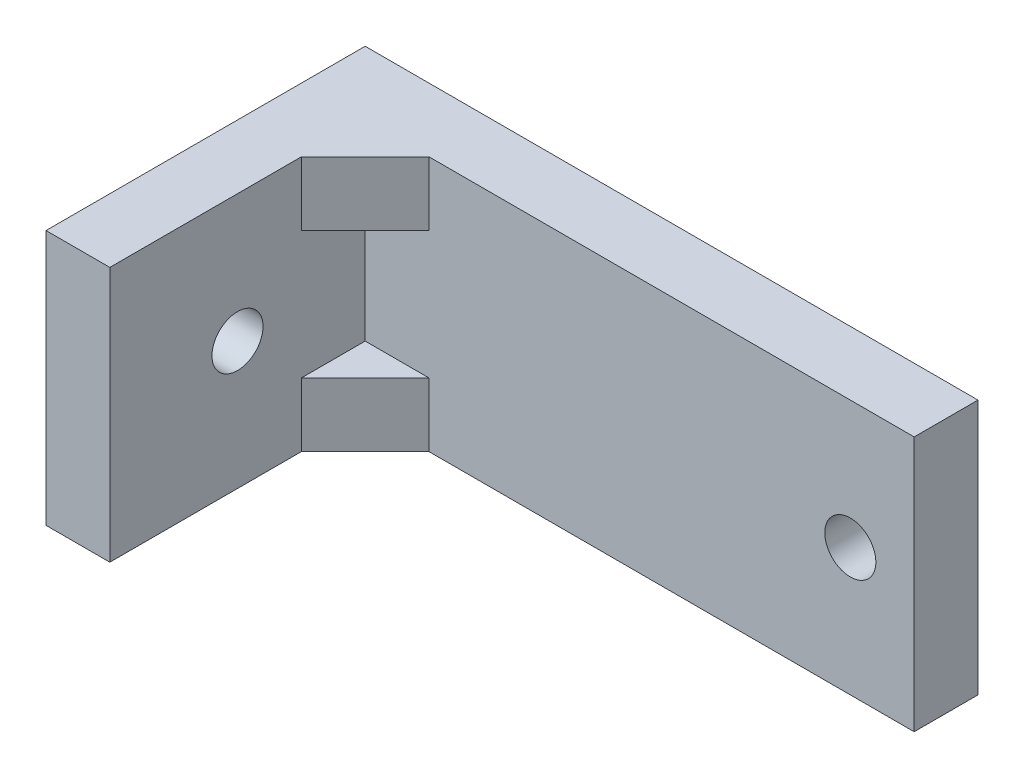
ISO-10303-21;
HEADER;
FILE_DESCRIPTION(('STEP AP214'),'2;1');
FILE_NAME('part.step','',(''),(''),'','','');
FILE_SCHEMA(('AUTOMOTIVE_DESIGN { 1 0 10303 214 1 1 1 1 }'));
ENDSEC;
DATA;
#1=APPLICATION_CONTEXT('core data for automotive mechanical design processes');
#2=APPLICATION_PROTOCOL_DEFINITION('international standard','automotive_design',2000,#1);
#3=PRODUCT_CONTEXT('',#1,'mechanical');
#4=PRODUCT('Part','Part','',(#3));
#5=PRODUCT_RELATED_PRODUCT_CATEGORY('part','',(#4));
#6=PRODUCT_DEFINITION_FORMATION('','',#4);
#7=PRODUCT_DEFINITION_CONTEXT('part definition',#1,'design');
#8=PRODUCT_DEFINITION('design','',#6,#7);
#9=PRODUCT_DEFINITION_SHAPE('','',#8);
#10=(LENGTH_UNIT() NAMED_UNIT(*) SI_UNIT(.MILLI.,.METRE.));
#11=(NAMED_UNIT(*) PLANE_ANGLE_UNIT() SI_UNIT($,.RADIAN.));
#12=(NAMED_UNIT(*) SI_UNIT($,.STERADIAN.) SOLID_ANGLE_UNIT());
#13=UNCERTAINTY_MEASURE_WITH_UNIT(LENGTH_MEASURE(1.E-05),#10,'distance_accuracy_value','');
#14=(GEOMETRIC_REPRESENTATION_CONTEXT(3) GLOBAL_UNCERTAINTY_ASSIGNED_CONTEXT((#13)) GLOBAL_UNIT_ASSIGNED_CONTEXT((#10,
#11,#12)) REPRESENTATION_CONTEXT('',''));
#15=CARTESIAN_POINT('',(0.,0.,0.));
#16=DIRECTION('',(0.,0.,1.));
#17=DIRECTION('',(1.,0.,0.));
#18=AXIS2_PLACEMENT_3D('',#15,#16,#17);
#19=CARTESIAN_POINT('',(0.,0.,5.));
#20=DIRECTION('',(0.,0.,1.));
#21=DIRECTION('',(1.,0.,0.));
#22=AXIS2_PLACEMENT_3D('',#19,#20,#21);
#23=PLANE('',#22);
#24=CARTESIAN_POINT('',(19.,0.,5.));
#25=DIRECTION('',(0.,0.,1.));
#26=DIRECTION('',(1.,0.,0.));
#27=AXIS2_PLACEMENT_3D('',#24,#25,#26);
#28=CIRCLE('',#27,2.);
#29=CARTESIAN_POINT('',(21.,0.,5.));
#30=VERTEX_POINT('',#29);
#31=EDGE_CURVE('E332',#30,#30,#28,.T.);
#32=ORIENTED_EDGE('',*,*,#31,.F.);
#33=EDGE_LOOP('',(#32));
#34=FACE_BOUND('',#33,.T.);
#35=DIRECTION('',(-1.,0.,0.));
#36=VECTOR('',#35,1.);
#37=CARTESIAN_POINT('',(-14.,-5.00000000000001,5.));
#38=LINE('',#37,#36);
#39=CARTESIAN_POINT('',(-14.,-5.00000000000001,5.));
#40=VERTEX_POINT('',#39);
#41=CARTESIAN_POINT('',(-19.,-5.,5.));
#42=VERTEX_POINT('',#41);
#43=EDGE_CURVE('E183',#40,#42,#38,.T.);
#44=ORIENTED_EDGE('',*,*,#43,.F.);
#45=DIRECTION('',(0.,1.,0.));
#46=VECTOR('',#45,1.);
#47=CARTESIAN_POINT('',(-14.,-10.,5.));
#48=LINE('',#47,#46);
#49=CARTESIAN_POINT('',(-14.,-10.,5.));
#50=VERTEX_POINT('',#49);
#51=EDGE_CURVE('E115',#50,#40,#48,.T.);
#52=ORIENTED_EDGE('',*,*,#51,.F.);
#53=DIRECTION('',(1.,0.,0.));
#54=VECTOR('',#53,1.);
#55=CARTESIAN_POINT('',(-24.,-10.,5.));
#56=LINE('',#55,#54);
#57=CARTESIAN_POINT('',(24.,-10.,5.));
#58=VERTEX_POINT('',#57);
#59=EDGE_CURVE('E125',#50,#58,#56,.T.);
#60=ORIENTED_EDGE('',*,*,#59,.T.);
#61=DIRECTION('',(0.,1.,0.));
#62=VECTOR('',#61,1.);
#63=CARTESIAN_POINT('',(24.,10.,5.));
#64=LINE('',#63,#62);
#65=CARTESIAN_POINT('',(24.,10.,5.));
#66=VERTEX_POINT('',#65);
#67=EDGE_CURVE('E145',#58,#66,#64,.T.);
#68=ORIENTED_EDGE('',*,*,#67,.T.);
#69=DIRECTION('',(-1.,0.,0.));
#70=VECTOR('',#69,1.);
#71=CARTESIAN_POINT('',(-24.,10.,5.));
#72=LINE('',#71,#70);
#73=CARTESIAN_POINT('',(-14.,10.,5.));
#74=VERTEX_POINT('',#73);
#75=EDGE_CURVE('E148',#66,#74,#72,.T.);
#76=ORIENTED_EDGE('',*,*,#75,.T.);
#77=DIRECTION('',(0.,1.,0.));
#78=VECTOR('',#77,1.);
#79=CARTESIAN_POINT('',(-14.,10.,5.));
#80=LINE('',#79,#78);
#81=CARTESIAN_POINT('',(-14.,5.,5.));
#82=VERTEX_POINT('',#81);
#83=EDGE_CURVE('E215',#82,#74,#80,.T.);
#84=ORIENTED_EDGE('',*,*,#83,.F.);
#85=DIRECTION('',(-1.,0.,0.));
#86=VECTOR('',#85,1.);
#87=CARTESIAN_POINT('',(-14.,5.,5.));
#88=LINE('',#87,#86);
#89=CARTESIAN_POINT('',(-19.,5.,5.));
#90=VERTEX_POINT('',#89);
#91=EDGE_CURVE('E189',#82,#90,#88,.T.);
#92=ORIENTED_EDGE('',*,*,#91,.T.);
#93=DIRECTION('',(0.,1.,0.));
#94=VECTOR('',#93,1.);
#95=CARTESIAN_POINT('',(-19.,10.,5.));
#96=LINE('',#95,#94);
#97=EDGE_CURVE('E195',#42,#90,#96,.T.);
#98=ORIENTED_EDGE('',*,*,#97,.F.);
#99=EDGE_LOOP('',(#44,#52,#60,#68,#76,#84,#92,#98));
#100=FACE_BOUND('',#99,.T.);
#101=ADVANCED_FACE('F34',(#34,#100),#23,.T.);
#102=CARTESIAN_POINT('',(-19.,10.,25.));
#103=DIRECTION('',(-1.,0.,0.));
#104=DIRECTION('',(0.,-1.,0.));
#105=AXIS2_PLACEMENT_3D('',#102,#103,#104);
#106=PLANE('',#105);
#107=DIRECTION('',(0.,0.,-1.));
#108=VECTOR('',#107,1.);
#109=CARTESIAN_POINT('',(-19.,5.,5.));
#110=LINE('',#109,#108);
#111=CARTESIAN_POINT('',(-19.,5.,10.));
#112=VERTEX_POINT('',#111);
#113=EDGE_CURVE('E203',#112,#90,#110,.T.);
#114=ORIENTED_EDGE('',*,*,#113,.F.);
#115=DIRECTION('',(0.,-1.,0.));
#116=VECTOR('',#115,1.);
#117=CARTESIAN_POINT('',(-19.,10.,10.));
#118=LINE('',#117,#116);
#119=CARTESIAN_POINT('',(-19.,10.,10.));
#120=VERTEX_POINT('',#119);
#121=EDGE_CURVE('E208',#120,#112,#118,.T.);
#122=ORIENTED_EDGE('',*,*,#121,.F.);
#123=DIRECTION('',(0.,0.,-1.));
#124=VECTOR('',#123,1.);
#125=CARTESIAN_POINT('',(-19.,10.,25.));
#126=LINE('',#125,#124);
#127=CARTESIAN_POINT('',(-19.,10.,25.));
#128=VERTEX_POINT('',#127);
#129=EDGE_CURVE('E135',#128,#120,#126,.T.);
#130=ORIENTED_EDGE('',*,*,#129,.F.);
#131=DIRECTION('',(0.,1.,0.));
#132=VECTOR('',#131,1.);
#133=CARTESIAN_POINT('',(-19.,10.,25.));
#134=LINE('',#133,#132);
#135=CARTESIAN_POINT('',(-19.,-10.,25.));
#136=VERTEX_POINT('',#135);
#137=EDGE_CURVE('E133',#136,#128,#134,.T.);
#138=ORIENTED_EDGE('',*,*,#137,.F.);
#139=DIRECTION('',(0.,0.,-1.));
#140=VECTOR('',#139,1.);
#141=CARTESIAN_POINT('',(-19.,-10.,25.));
#142=LINE('',#141,#140);
#143=CARTESIAN_POINT('',(-19.,-10.,10.));
#144=VERTEX_POINT('',#143);
#145=EDGE_CURVE('E122',#136,#144,#142,.T.);
#146=ORIENTED_EDGE('',*,*,#145,.T.);
#147=DIRECTION('',(0.,-1.,0.));
#148=VECTOR('',#147,1.);
#149=CARTESIAN_POINT('',(-19.,-10.,10.));
#150=LINE('',#149,#148);
#151=CARTESIAN_POINT('',(-19.,-5.00000000000001,10.));
#152=VERTEX_POINT('',#151);
#153=EDGE_CURVE('E110',#152,#144,#150,.T.);
#154=ORIENTED_EDGE('',*,*,#153,.F.);
#155=DIRECTION('',(0.,0.,1.));
#156=VECTOR('',#155,1.);
#157=CARTESIAN_POINT('',(-19.,-5.00000000000001,5.));
#158=LINE('',#157,#156);
#159=EDGE_CURVE('E57',#42,#152,#158,.T.);
#160=ORIENTED_EDGE('',*,*,#159,.F.);
#161=ORIENTED_EDGE('',*,*,#97,.T.);
#162=EDGE_LOOP('',(#114,#122,#130,#138,#146,#154,#160,#161));
#163=FACE_BOUND('',#162,.T.);
#164=CARTESIAN_POINT('',(-19.,0.,15.));
#165=DIRECTION('',(1.,0.,0.));
#166=DIRECTION('',(0.,0.,-1.));
#167=AXIS2_PLACEMENT_3D('',#164,#165,#166);
#168=CIRCLE('',#167,2.);
#169=CARTESIAN_POINT('',(-19.,0.,13.));
#170=VERTEX_POINT('',#169);
#171=EDGE_CURVE('E185',#170,#170,#168,.T.);
#172=ORIENTED_EDGE('',*,*,#171,.F.);
#173=EDGE_LOOP('',(#172));
#174=FACE_BOUND('',#173,.T.);
#175=ADVANCED_FACE('F130',(#163,#174),#106,.F.);
#176=CARTESIAN_POINT('',(24.,10.,5.));
#177=DIRECTION('',(-1.,0.,0.));
#178=DIRECTION('',(0.,0.,1.));
#179=AXIS2_PLACEMENT_3D('',#176,#177,#178);
#180=PLANE('',#179);
#181=DIRECTION('',(0.,1.,0.));
#182=VECTOR('',#181,1.);
#183=CARTESIAN_POINT('',(24.,10.,0.));
#184=LINE('',#183,#182);
#185=CARTESIAN_POINT('',(24.,-10.,0.));
#186=VERTEX_POINT('',#185);
#187=CARTESIAN_POINT('',(24.,10.,0.));
#188=VERTEX_POINT('',#187);
#189=EDGE_CURVE('E134',#186,#188,#184,.T.);
#190=ORIENTED_EDGE('',*,*,#189,.T.);
#191=DIRECTION('',(0.,0.,-1.));
#192=VECTOR('',#191,1.);
#193=CARTESIAN_POINT('',(24.,10.,5.));
#194=LINE('',#193,#192);
#195=EDGE_CURVE('E11',#66,#188,#194,.T.);
#196=ORIENTED_EDGE('',*,*,#195,.F.);
#197=ORIENTED_EDGE('',*,*,#67,.F.);
#198=DIRECTION('',(0.,0.,-1.));
#199=VECTOR('',#198,1.);
#200=CARTESIAN_POINT('',(24.,-10.,5.));
#201=LINE('',#200,#199);
#202=EDGE_CURVE('E152',#58,#186,#201,.T.);
#203=ORIENTED_EDGE('',*,*,#202,.T.);
#204=EDGE_LOOP('',(#190,#196,#197,#203));
#205=FACE_BOUND('',#204,.T.);
#206=ADVANCED_FACE('F36',(#205),#180,.F.);
#207=CARTESIAN_POINT('',(-24.,10.,5.));
#208=DIRECTION('',(0.,-1.,0.));
#209=DIRECTION('',(0.,0.,-1.));
#210=AXIS2_PLACEMENT_3D('',#207,#208,#209);
#211=PLANE('',#210);
#212=ORIENTED_EDGE('',*,*,#129,.T.);
#213=DIRECTION('',(-0.707106781186548,0.,0.707106781186548));
#214=VECTOR('',#213,1.);
#215=CARTESIAN_POINT('',(-14.,10.,5.));
#216=LINE('',#215,#214);
#217=EDGE_CURVE('E127',#74,#120,#216,.T.);
#218=ORIENTED_EDGE('',*,*,#217,.F.);
#219=ORIENTED_EDGE('',*,*,#75,.F.);
#220=ORIENTED_EDGE('',*,*,#195,.T.);
#221=DIRECTION('',(-1.,0.,0.));
#222=VECTOR('',#221,1.);
#223=CARTESIAN_POINT('',(-24.,10.,0.));
#224=LINE('',#223,#222);
#225=CARTESIAN_POINT('',(-24.,10.,0.));
#226=VERTEX_POINT('',#225);
#227=EDGE_CURVE('E138',#188,#226,#224,.T.);
#228=ORIENTED_EDGE('',*,*,#227,.T.);
#229=DIRECTION('',(0.,0.,-1.));
#230=VECTOR('',#229,1.);
#231=CARTESIAN_POINT('',(-24.,10.,5.));
#232=LINE('',#231,#230);
#233=CARTESIAN_POINT('',(-24.,10.,25.));
#234=VERTEX_POINT('',#233);
#235=EDGE_CURVE('E42',#234,#226,#232,.T.);
#236=ORIENTED_EDGE('',*,*,#235,.F.);
#237=DIRECTION('',(-1.,0.,0.));
#238=VECTOR('',#237,1.);
#239=CARTESIAN_POINT('',(-24.,10.,25.));
#240=LINE('',#239,#238);
#241=EDGE_CURVE('E141',#128,#234,#240,.T.);
#242=ORIENTED_EDGE('',*,*,#241,.F.);
#243=EDGE_LOOP('',(#212,#218,#219,#220,#228,#236,#242));
#244=FACE_BOUND('',#243,.T.);
#245=ADVANCED_FACE('F221',(#244),#211,.F.);
#246=CARTESIAN_POINT('',(-24.,10.,5.));
#247=DIRECTION('',(1.,0.,0.));
#248=DIRECTION('',(0.,0.,-1.));
#249=AXIS2_PLACEMENT_3D('',#246,#247,#248);
#250=PLANE('',#249);
#251=CARTESIAN_POINT('',(-24.,0.,15.));
#252=DIRECTION('',(1.,0.,0.));
#253=DIRECTION('',(0.,0.,-1.));
#254=AXIS2_PLACEMENT_3D('',#251,#252,#253);
#255=CIRCLE('',#254,2.);
#256=CARTESIAN_POINT('',(-24.,0.,13.));
#257=VERTEX_POINT('',#256);
#258=EDGE_CURVE('E192',#257,#257,#255,.T.);
#259=ORIENTED_EDGE('',*,*,#258,.T.);
#260=EDGE_LOOP('',(#259));
#261=FACE_BOUND('',#260,.T.);
#262=DIRECTION('',(0.,-1.,0.));
#263=VECTOR('',#262,1.);
#264=CARTESIAN_POINT('',(-24.,10.,0.));
#265=LINE('',#264,#263);
#266=CARTESIAN_POINT('',(-24.,-10.,0.));
#267=VERTEX_POINT('',#266);
#268=EDGE_CURVE('E155',#226,#267,#265,.T.);
#269=ORIENTED_EDGE('',*,*,#268,.T.);
#270=DIRECTION('',(0.,0.,-1.));
#271=VECTOR('',#270,1.);
#272=CARTESIAN_POINT('',(-24.,-10.,5.));
#273=LINE('',#272,#271);
#274=CARTESIAN_POINT('',(-24.,-10.,25.));
#275=VERTEX_POINT('',#274);
#276=EDGE_CURVE('E160',#275,#267,#273,.T.);
#277=ORIENTED_EDGE('',*,*,#276,.F.);
#278=DIRECTION('',(0.,-1.,0.));
#279=VECTOR('',#278,1.);
#280=CARTESIAN_POINT('',(-24.,10.,25.));
#281=LINE('',#280,#279);
#282=EDGE_CURVE('E168',#234,#275,#281,.T.);
#283=ORIENTED_EDGE('',*,*,#282,.F.);
#284=ORIENTED_EDGE('',*,*,#235,.T.);
#285=EDGE_LOOP('',(#269,#277,#283,#284));
#286=FACE_BOUND('',#285,.T.);
#287=ADVANCED_FACE('F166',(#261,#286),#250,.F.);
#288=CARTESIAN_POINT('',(-24.,-10.,5.));
#289=DIRECTION('',(0.,1.,0.));
#290=DIRECTION('',(0.,0.,1.));
#291=AXIS2_PLACEMENT_3D('',#288,#289,#290);
#292=PLANE('',#291);
#293=ORIENTED_EDGE('',*,*,#59,.F.);
#294=DIRECTION('',(-0.707106781186548,0.,0.707106781186548));
#295=VECTOR('',#294,1.);
#296=CARTESIAN_POINT('',(-14.,-10.,5.));
#297=LINE('',#296,#295);
#298=EDGE_CURVE('E49',#50,#144,#297,.T.);
#299=ORIENTED_EDGE('',*,*,#298,.T.);
#300=ORIENTED_EDGE('',*,*,#145,.F.);
#301=DIRECTION('',(1.,0.,0.));
#302=VECTOR('',#301,1.);
#303=CARTESIAN_POINT('',(-24.,-10.,25.));
#304=LINE('',#303,#302);
#305=EDGE_CURVE('E199',#275,#136,#304,.T.);
#306=ORIENTED_EDGE('',*,*,#305,.F.);
#307=ORIENTED_EDGE('',*,*,#276,.T.);
#308=DIRECTION('',(1.,0.,0.));
#309=VECTOR('',#308,1.);
#310=CARTESIAN_POINT('',(-24.,-10.,0.));
#311=LINE('',#310,#309);
#312=EDGE_CURVE('E149',#267,#186,#311,.T.);
#313=ORIENTED_EDGE('',*,*,#312,.T.);
#314=ORIENTED_EDGE('',*,*,#202,.F.);
#315=EDGE_LOOP('',(#293,#299,#300,#306,#307,#313,#314));
#316=FACE_BOUND('',#315,.T.);
#317=ADVANCED_FACE('F120',(#316),#292,.F.);
#318=CARTESIAN_POINT('',(0.,0.,0.));
#319=DIRECTION('',(0.,0.,1.));
#320=DIRECTION('',(1.,0.,0.));
#321=AXIS2_PLACEMENT_3D('',#318,#319,#320);
#322=PLANE('',#321);
#323=CARTESIAN_POINT('',(19.,0.,0.));
#324=DIRECTION('',(0.,0.,-1.));
#325=DIRECTION('',(-1.,0.,0.));
#326=AXIS2_PLACEMENT_3D('',#323,#324,#325);
#327=CIRCLE('',#326,2.);
#328=CARTESIAN_POINT('',(17.,0.,0.));
#329=VERTEX_POINT('',#328);
#330=EDGE_CURVE('E335',#329,#329,#327,.T.);
#331=ORIENTED_EDGE('',*,*,#330,.F.);
#332=EDGE_LOOP('',(#331));
#333=FACE_BOUND('',#332,.T.);
#334=ORIENTED_EDGE('',*,*,#189,.F.);
#335=ORIENTED_EDGE('',*,*,#312,.F.);
#336=ORIENTED_EDGE('',*,*,#268,.F.);
#337=ORIENTED_EDGE('',*,*,#227,.F.);
#338=EDGE_LOOP('',(#334,#335,#336,#337));
#339=FACE_BOUND('',#338,.T.);
#340=ADVANCED_FACE('F175',(#333,#339),#322,.F.);
#341=CARTESIAN_POINT('',(0.,0.,25.));
#342=DIRECTION('',(0.,0.,1.));
#343=DIRECTION('',(1.,0.,0.));
#344=AXIS2_PLACEMENT_3D('',#341,#342,#343);
#345=PLANE('',#344);
#346=ORIENTED_EDGE('',*,*,#282,.T.);
#347=ORIENTED_EDGE('',*,*,#305,.T.);
#348=ORIENTED_EDGE('',*,*,#137,.T.);
#349=ORIENTED_EDGE('',*,*,#241,.T.);
#350=EDGE_LOOP('',(#346,#347,#348,#349));
#351=FACE_BOUND('',#350,.T.);
#352=ADVANCED_FACE('F223',(#351),#345,.T.);
#353=CARTESIAN_POINT('',(-24.,0.,15.));
#354=DIRECTION('',(1.,0.,0.));
#355=DIRECTION('',(0.,0.,-1.));
#356=AXIS2_PLACEMENT_3D('',#353,#354,#355);
#357=CYLINDRICAL_SURFACE('',#356,2.);
#358=ORIENTED_EDGE('',*,*,#258,.F.);
#359=EDGE_LOOP('',(#358));
#360=FACE_BOUND('',#359,.T.);
#361=ORIENTED_EDGE('',*,*,#171,.T.);
#362=EDGE_LOOP('',(#361));
#363=FACE_BOUND('',#362,.T.);
#364=ADVANCED_FACE('F225',(#360,#363),#357,.F.);
#365=CARTESIAN_POINT('',(-14.,-5.00000000000001,5.));
#366=DIRECTION('',(0.,-1.,0.));
#367=DIRECTION('',(0.,0.,-1.));
#368=AXIS2_PLACEMENT_3D('',#365,#366,#367);
#369=PLANE('',#368);
#370=ORIENTED_EDGE('',*,*,#159,.T.);
#371=DIRECTION('',(0.707106781186548,0.,-0.707106781186548));
#372=VECTOR('',#371,1.);
#373=CARTESIAN_POINT('',(-14.,-5.00000000000001,5.));
#374=LINE('',#373,#372);
#375=EDGE_CURVE('E113',#152,#40,#374,.T.);
#376=ORIENTED_EDGE('',*,*,#375,.T.);
#377=ORIENTED_EDGE('',*,*,#43,.T.);
#378=EDGE_LOOP('',(#370,#376,#377));
#379=FACE_BOUND('',#378,.T.);
#380=ADVANCED_FACE('F207',(#379),#369,.F.);
#381=CARTESIAN_POINT('',(-14.,5.,5.));
#382=DIRECTION('',(0.,1.,0.));
#383=DIRECTION('',(0.,0.,1.));
#384=AXIS2_PLACEMENT_3D('',#381,#382,#383);
#385=PLANE('',#384);
#386=ORIENTED_EDGE('',*,*,#91,.F.);
#387=DIRECTION('',(-0.707106781186548,0.,0.707106781186548));
#388=VECTOR('',#387,1.);
#389=CARTESIAN_POINT('',(-14.,5.,5.));
#390=LINE('',#389,#388);
#391=EDGE_CURVE('E126',#82,#112,#390,.T.);
#392=ORIENTED_EDGE('',*,*,#391,.T.);
#393=ORIENTED_EDGE('',*,*,#113,.T.);
#394=EDGE_LOOP('',(#386,#392,#393));
#395=FACE_BOUND('',#394,.T.);
#396=ADVANCED_FACE('F217',(#395),#385,.F.);
#397=CARTESIAN_POINT('',(-14.,-10.,5.));
#398=DIRECTION('',(-0.707106781186547,0.,-0.707106781186547));
#399=DIRECTION('',(-0.707106781186548,0.,0.707106781186548));
#400=AXIS2_PLACEMENT_3D('',#397,#398,#399);
#401=PLANE('',#400);
#402=ORIENTED_EDGE('',*,*,#83,.T.);
#403=ORIENTED_EDGE('',*,*,#217,.T.);
#404=ORIENTED_EDGE('',*,*,#121,.T.);
#405=ORIENTED_EDGE('',*,*,#391,.F.);
#406=EDGE_LOOP('',(#402,#403,#404,#405));
#407=FACE_BOUND('',#406,.T.);
#408=ADVANCED_FACE('F219',(#407),#401,.F.);
#409=ORIENTED_EDGE('',*,*,#153,.T.);
#410=ORIENTED_EDGE('',*,*,#298,.F.);
#411=ORIENTED_EDGE('',*,*,#51,.T.);
#412=ORIENTED_EDGE('',*,*,#375,.F.);
#413=EDGE_LOOP('',(#409,#410,#411,#412));
#414=FACE_BOUND('',#413,.T.);
#415=ADVANCED_FACE('F111',(#414),#401,.F.);
#416=CARTESIAN_POINT('',(19.,0.,25.));
#417=DIRECTION('',(0.,0.,-1.));
#418=DIRECTION('',(-1.,0.,0.));
#419=AXIS2_PLACEMENT_3D('',#416,#417,#418);
#420=CYLINDRICAL_SURFACE('',#419,2.);
#421=ORIENTED_EDGE('',*,*,#31,.T.);
#422=EDGE_LOOP('',(#421));
#423=FACE_BOUND('',#422,.T.);
#424=ORIENTED_EDGE('',*,*,#330,.T.);
#425=EDGE_LOOP('',(#424));
#426=FACE_BOUND('',#425,.T.);
#427=ADVANCED_FACE('F307',(#423,#426),#420,.F.);
#428=CLOSED_SHELL('',(#101,#175,#206,#245,#287,#317,#340,#352,#364,#380,#396,#408,#415,#427));
#429=MANIFOLD_SOLID_BREP('B2',#428);
#430=ADVANCED_BREP_SHAPE_REPRESENTATION('',(#18,#429),#14);
#431=SHAPE_DEFINITION_REPRESENTATION(#9,#430);
ENDSEC;
END-ISO-10303-21;
